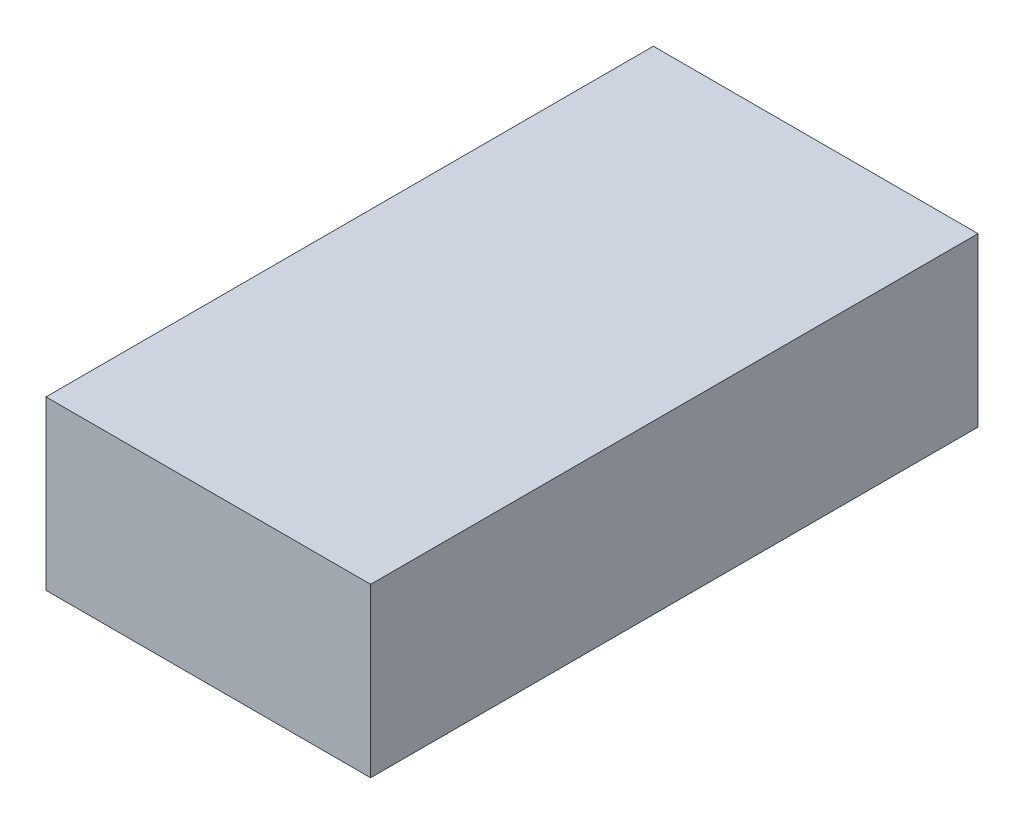
ISO-10303-21;
HEADER;
FILE_DESCRIPTION(('STEP AP214'),'2;1');
FILE_NAME('part.step','',(''),(''),'','','');
FILE_SCHEMA(('AUTOMOTIVE_DESIGN { 1 0 10303 214 1 1 1 1 }'));
ENDSEC;
DATA;
#1=APPLICATION_CONTEXT('core data for automotive mechanical design processes');
#2=APPLICATION_PROTOCOL_DEFINITION('international standard','automotive_design',2000,#1);
#3=PRODUCT_CONTEXT('',#1,'mechanical');
#4=PRODUCT('Part','Part','',(#3));
#5=PRODUCT_RELATED_PRODUCT_CATEGORY('part','',(#4));
#6=PRODUCT_DEFINITION_FORMATION('','',#4);
#7=PRODUCT_DEFINITION_CONTEXT('part definition',#1,'design');
#8=PRODUCT_DEFINITION('design','',#6,#7);
#9=PRODUCT_DEFINITION_SHAPE('','',#8);
#10=(LENGTH_UNIT() NAMED_UNIT(*) SI_UNIT(.MILLI.,.METRE.));
#11=(NAMED_UNIT(*) PLANE_ANGLE_UNIT() SI_UNIT($,.RADIAN.));
#12=(NAMED_UNIT(*) SI_UNIT($,.STERADIAN.) SOLID_ANGLE_UNIT());
#13=UNCERTAINTY_MEASURE_WITH_UNIT(LENGTH_MEASURE(1.E-05),#10,'distance_accuracy_value','');
#14=(GEOMETRIC_REPRESENTATION_CONTEXT(3) GLOBAL_UNCERTAINTY_ASSIGNED_CONTEXT((#13)) GLOBAL_UNIT_ASSIGNED_CONTEXT((#10,
#11,#12)) REPRESENTATION_CONTEXT('',''));
#15=CARTESIAN_POINT('',(0.,0.,0.));
#16=DIRECTION('',(0.,0.,1.));
#17=DIRECTION('',(1.,0.,0.));
#18=AXIS2_PLACEMENT_3D('',#15,#16,#17);
#19=CARTESIAN_POINT('',(0.,16.,0.));
#20=DIRECTION('',(1.,0.,0.));
#21=DIRECTION('',(0.,0.,-1.));
#22=AXIS2_PLACEMENT_3D('',#19,#20,#21);
#23=PLANE('',#22);
#24=DIRECTION('',(0.,0.,1.));
#25=VECTOR('',#24,1.);
#26=CARTESIAN_POINT('',(0.,0.,0.));
#27=LINE('',#26,#25);
#28=CARTESIAN_POINT('',(0.,0.,0.));
#29=VERTEX_POINT('',#28);
#30=CARTESIAN_POINT('',(0.,0.,58.));
#31=VERTEX_POINT('',#30);
#32=EDGE_CURVE('E96',#29,#31,#27,.T.);
#33=ORIENTED_EDGE('',*,*,#32,.T.);
#34=DIRECTION('',(0.,-1.,0.));
#35=VECTOR('',#34,1.);
#36=CARTESIAN_POINT('',(0.,16.,58.));
#37=LINE('',#36,#35);
#38=CARTESIAN_POINT('',(0.,16.,58.));
#39=VERTEX_POINT('',#38);
#40=EDGE_CURVE('E11',#39,#31,#37,.T.);
#41=ORIENTED_EDGE('',*,*,#40,.F.);
#42=DIRECTION('',(0.,0.,1.));
#43=VECTOR('',#42,1.);
#44=CARTESIAN_POINT('',(0.,16.,0.));
#45=LINE('',#44,#43);
#46=CARTESIAN_POINT('',(0.,16.,0.));
#47=VERTEX_POINT('',#46);
#48=EDGE_CURVE('E84',#47,#39,#45,.T.);
#49=ORIENTED_EDGE('',*,*,#48,.F.);
#50=DIRECTION('',(0.,-1.,0.));
#51=VECTOR('',#50,1.);
#52=CARTESIAN_POINT('',(0.,16.,0.));
#53=LINE('',#52,#51);
#54=EDGE_CURVE('E92',#47,#29,#53,.T.);
#55=ORIENTED_EDGE('',*,*,#54,.T.);
#56=EDGE_LOOP('',(#33,#41,#49,#55));
#57=FACE_BOUND('',#56,.T.);
#58=ADVANCED_FACE('F33',(#57),#23,.F.);
#59=CARTESIAN_POINT('',(0.,16.,58.));
#60=DIRECTION('',(0.,0.,-1.));
#61=DIRECTION('',(-1.,0.,0.));
#62=AXIS2_PLACEMENT_3D('',#59,#60,#61);
#63=PLANE('',#62);
#64=DIRECTION('',(1.,0.,0.));
#65=VECTOR('',#64,1.);
#66=CARTESIAN_POINT('',(0.,0.,58.));
#67=LINE('',#66,#65);
#68=CARTESIAN_POINT('',(31.,0.,58.));
#69=VERTEX_POINT('',#68);
#70=EDGE_CURVE('E88',#31,#69,#67,.T.);
#71=ORIENTED_EDGE('',*,*,#70,.T.);
#72=DIRECTION('',(0.,-1.,0.));
#73=VECTOR('',#72,1.);
#74=CARTESIAN_POINT('',(31.,16.,58.));
#75=LINE('',#74,#73);
#76=CARTESIAN_POINT('',(31.,16.,58.));
#77=VERTEX_POINT('',#76);
#78=EDGE_CURVE('E41',#77,#69,#75,.T.);
#79=ORIENTED_EDGE('',*,*,#78,.F.);
#80=DIRECTION('',(1.,0.,0.));
#81=VECTOR('',#80,1.);
#82=CARTESIAN_POINT('',(0.,16.,58.));
#83=LINE('',#82,#81);
#84=EDGE_CURVE('E79',#39,#77,#83,.T.);
#85=ORIENTED_EDGE('',*,*,#84,.F.);
#86=ORIENTED_EDGE('',*,*,#40,.T.);
#87=EDGE_LOOP('',(#71,#79,#85,#86));
#88=FACE_BOUND('',#87,.T.);
#89=ADVANCED_FACE('F87',(#88),#63,.F.);
#90=CARTESIAN_POINT('',(31.,16.,0.));
#91=DIRECTION('',(-1.,0.,0.));
#92=DIRECTION('',(0.,0.,1.));
#93=AXIS2_PLACEMENT_3D('',#90,#91,#92);
#94=PLANE('',#93);
#95=DIRECTION('',(0.,0.,-1.));
#96=VECTOR('',#95,1.);
#97=CARTESIAN_POINT('',(31.,0.,0.));
#98=LINE('',#97,#96);
#99=CARTESIAN_POINT('',(31.,0.,0.));
#100=VERTEX_POINT('',#99);
#101=EDGE_CURVE('E66',#69,#100,#98,.T.);
#102=ORIENTED_EDGE('',*,*,#101,.T.);
#103=DIRECTION('',(0.,-1.,0.));
#104=VECTOR('',#103,1.);
#105=CARTESIAN_POINT('',(31.,16.,0.));
#106=LINE('',#105,#104);
#107=CARTESIAN_POINT('',(31.,16.,0.));
#108=VERTEX_POINT('',#107);
#109=EDGE_CURVE('E89',#108,#100,#106,.T.);
#110=ORIENTED_EDGE('',*,*,#109,.F.);
#111=DIRECTION('',(0.,0.,-1.));
#112=VECTOR('',#111,1.);
#113=CARTESIAN_POINT('',(31.,16.,0.));
#114=LINE('',#113,#112);
#115=EDGE_CURVE('E82',#77,#108,#114,.T.);
#116=ORIENTED_EDGE('',*,*,#115,.F.);
#117=ORIENTED_EDGE('',*,*,#78,.T.);
#118=EDGE_LOOP('',(#102,#110,#116,#117));
#119=FACE_BOUND('',#118,.T.);
#120=ADVANCED_FACE('F90',(#119),#94,.F.);
#121=CARTESIAN_POINT('',(0.,16.,0.));
#122=DIRECTION('',(0.,0.,1.));
#123=DIRECTION('',(1.,0.,0.));
#124=AXIS2_PLACEMENT_3D('',#121,#122,#123);
#125=PLANE('',#124);
#126=DIRECTION('',(-1.,0.,0.));
#127=VECTOR('',#126,1.);
#128=CARTESIAN_POINT('',(0.,0.,0.));
#129=LINE('',#128,#127);
#130=EDGE_CURVE('E72',#100,#29,#129,.T.);
#131=ORIENTED_EDGE('',*,*,#130,.T.);
#132=ORIENTED_EDGE('',*,*,#54,.F.);
#133=DIRECTION('',(-1.,0.,0.));
#134=VECTOR('',#133,1.);
#135=CARTESIAN_POINT('',(0.,16.,0.));
#136=LINE('',#135,#134);
#137=EDGE_CURVE('E49',#108,#47,#136,.T.);
#138=ORIENTED_EDGE('',*,*,#137,.F.);
#139=ORIENTED_EDGE('',*,*,#109,.T.);
#140=EDGE_LOOP('',(#131,#132,#138,#139));
#141=FACE_BOUND('',#140,.T.);
#142=ADVANCED_FACE('F103',(#141),#125,.F.);
#143=CARTESIAN_POINT('',(0.,16.,0.));
#144=DIRECTION('',(0.,1.,0.));
#145=DIRECTION('',(0.,0.,1.));
#146=AXIS2_PLACEMENT_3D('',#143,#144,#145);
#147=PLANE('',#146);
#148=ORIENTED_EDGE('',*,*,#48,.T.);
#149=ORIENTED_EDGE('',*,*,#84,.T.);
#150=ORIENTED_EDGE('',*,*,#115,.T.);
#151=ORIENTED_EDGE('',*,*,#137,.T.);
#152=EDGE_LOOP('',(#148,#149,#150,#151));
#153=FACE_BOUND('',#152,.T.);
#154=ADVANCED_FACE('F80',(#153),#147,.T.);
#155=CARTESIAN_POINT('',(0.,0.,0.));
#156=DIRECTION('',(0.,1.,0.));
#157=DIRECTION('',(0.,0.,1.));
#158=AXIS2_PLACEMENT_3D('',#155,#156,#157);
#159=PLANE('',#158);
#160=ORIENTED_EDGE('',*,*,#32,.F.);
#161=ORIENTED_EDGE('',*,*,#130,.F.);
#162=ORIENTED_EDGE('',*,*,#101,.F.);
#163=ORIENTED_EDGE('',*,*,#70,.F.);
#164=EDGE_LOOP('',(#160,#161,#162,#163));
#165=FACE_BOUND('',#164,.T.);
#166=ADVANCED_FACE('F106',(#165),#159,.F.);
#167=CLOSED_SHELL('',(#58,#89,#120,#142,#154,#166));
#168=MANIFOLD_SOLID_BREP('B2',#167);
#169=ADVANCED_BREP_SHAPE_REPRESENTATION('',(#18,#168),#14);
#170=SHAPE_DEFINITION_REPRESENTATION(#9,#169);
ENDSEC;
END-ISO-10303-21;
